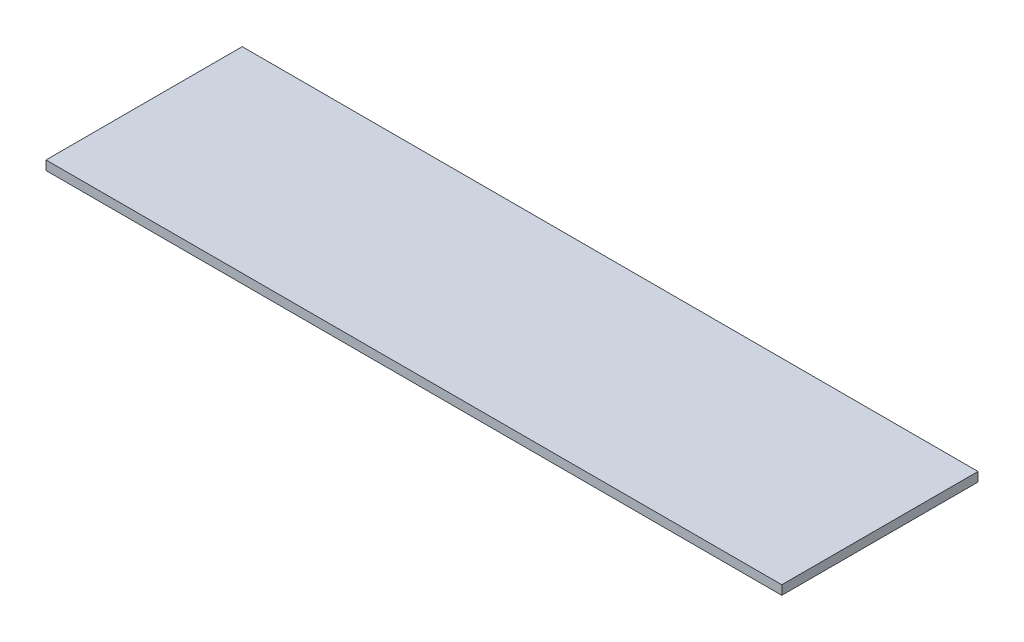
ISO-10303-21;
HEADER;
FILE_DESCRIPTION(('STEP AP214'),'2;1');
FILE_NAME('part.step','',(''),(''),'','','');
FILE_SCHEMA(('AUTOMOTIVE_DESIGN { 1 0 10303 214 1 1 1 1 }'));
ENDSEC;
DATA;
#1=APPLICATION_CONTEXT('core data for automotive mechanical design processes');
#2=APPLICATION_PROTOCOL_DEFINITION('international standard','automotive_design',2000,#1);
#3=PRODUCT_CONTEXT('',#1,'mechanical');
#4=PRODUCT('Part','Part','',(#3));
#5=PRODUCT_RELATED_PRODUCT_CATEGORY('part','',(#4));
#6=PRODUCT_DEFINITION_FORMATION('','',#4);
#7=PRODUCT_DEFINITION_CONTEXT('part definition',#1,'design');
#8=PRODUCT_DEFINITION('design','',#6,#7);
#9=PRODUCT_DEFINITION_SHAPE('','',#8);
#10=(LENGTH_UNIT() NAMED_UNIT(*) SI_UNIT(.MILLI.,.METRE.));
#11=(NAMED_UNIT(*) PLANE_ANGLE_UNIT() SI_UNIT($,.RADIAN.));
#12=(NAMED_UNIT(*) SI_UNIT($,.STERADIAN.) SOLID_ANGLE_UNIT());
#13=UNCERTAINTY_MEASURE_WITH_UNIT(LENGTH_MEASURE(1.E-05),#10,'distance_accuracy_value','');
#14=(GEOMETRIC_REPRESENTATION_CONTEXT(3) GLOBAL_UNCERTAINTY_ASSIGNED_CONTEXT((#13)) GLOBAL_UNIT_ASSIGNED_CONTEXT((#10,
#11,#12)) REPRESENTATION_CONTEXT('',''));
#15=CARTESIAN_POINT('',(0.,0.,0.));
#16=DIRECTION('',(0.,0.,1.));
#17=DIRECTION('',(1.,0.,0.));
#18=AXIS2_PLACEMENT_3D('',#15,#16,#17);
#19=CARTESIAN_POINT('',(0.,4.7625,0.));
#20=DIRECTION('',(1.,0.,0.));
#21=DIRECTION('',(0.,0.,-1.));
#22=AXIS2_PLACEMENT_3D('',#19,#20,#21);
#23=PLANE('',#22);
#24=DIRECTION('',(0.,0.,1.));
#25=VECTOR('',#24,1.);
#26=CARTESIAN_POINT('',(0.,0.,0.));
#27=LINE('',#26,#25);
#28=CARTESIAN_POINT('',(0.,0.,-101.6));
#29=VERTEX_POINT('',#28);
#30=CARTESIAN_POINT('',(0.,0.,0.));
#31=VERTEX_POINT('',#30);
#32=EDGE_CURVE('E102',#29,#31,#27,.T.);
#33=ORIENTED_EDGE('',*,*,#32,.T.);
#34=DIRECTION('',(0.,-1.,0.));
#35=VECTOR('',#34,1.);
#36=CARTESIAN_POINT('',(0.,4.7625,0.));
#37=LINE('',#36,#35);
#38=CARTESIAN_POINT('',(0.,4.7625,0.));
#39=VERTEX_POINT('',#38);
#40=EDGE_CURVE('E11',#39,#31,#37,.T.);
#41=ORIENTED_EDGE('',*,*,#40,.F.);
#42=DIRECTION('',(0.,0.,1.));
#43=VECTOR('',#42,1.);
#44=CARTESIAN_POINT('',(0.,4.7625,0.));
#45=LINE('',#44,#43);
#46=CARTESIAN_POINT('',(0.,4.7625,-101.6));
#47=VERTEX_POINT('',#46);
#48=EDGE_CURVE('E90',#47,#39,#45,.T.);
#49=ORIENTED_EDGE('',*,*,#48,.F.);
#50=DIRECTION('',(0.,-1.,0.));
#51=VECTOR('',#50,1.);
#52=CARTESIAN_POINT('',(0.,4.7625,-101.6));
#53=LINE('',#52,#51);
#54=EDGE_CURVE('E98',#47,#29,#53,.T.);
#55=ORIENTED_EDGE('',*,*,#54,.T.);
#56=EDGE_LOOP('',(#33,#41,#49,#55));
#57=FACE_BOUND('',#56,.T.);
#58=ADVANCED_FACE('F39',(#57),#23,.F.);
#59=CARTESIAN_POINT('',(0.,4.7625,0.));
#60=DIRECTION('',(0.,0.,-1.));
#61=DIRECTION('',(-1.,0.,0.));
#62=AXIS2_PLACEMENT_3D('',#59,#60,#61);
#63=PLANE('',#62);
#64=DIRECTION('',(1.,0.,0.));
#65=VECTOR('',#64,1.);
#66=CARTESIAN_POINT('',(0.,0.,0.));
#67=LINE('',#66,#65);
#68=CARTESIAN_POINT('',(381.,0.,0.));
#69=VERTEX_POINT('',#68);
#70=EDGE_CURVE('E94',#31,#69,#67,.T.);
#71=ORIENTED_EDGE('',*,*,#70,.T.);
#72=DIRECTION('',(0.,-1.,0.));
#73=VECTOR('',#72,1.);
#74=CARTESIAN_POINT('',(381.,4.7625,0.));
#75=LINE('',#74,#73);
#76=CARTESIAN_POINT('',(381.,4.7625,0.));
#77=VERTEX_POINT('',#76);
#78=EDGE_CURVE('E47',#77,#69,#75,.T.);
#79=ORIENTED_EDGE('',*,*,#78,.F.);
#80=DIRECTION('',(1.,0.,0.));
#81=VECTOR('',#80,1.);
#82=CARTESIAN_POINT('',(0.,4.7625,0.));
#83=LINE('',#82,#81);
#84=EDGE_CURVE('E85',#39,#77,#83,.T.);
#85=ORIENTED_EDGE('',*,*,#84,.F.);
#86=ORIENTED_EDGE('',*,*,#40,.T.);
#87=EDGE_LOOP('',(#71,#79,#85,#86));
#88=FACE_BOUND('',#87,.T.);
#89=ADVANCED_FACE('F93',(#88),#63,.F.);
#90=CARTESIAN_POINT('',(381.,4.7625,0.));
#91=DIRECTION('',(-1.,0.,0.));
#92=DIRECTION('',(0.,0.,1.));
#93=AXIS2_PLACEMENT_3D('',#90,#91,#92);
#94=PLANE('',#93);
#95=DIRECTION('',(0.,0.,-1.));
#96=VECTOR('',#95,1.);
#97=CARTESIAN_POINT('',(381.,0.,0.));
#98=LINE('',#97,#96);
#99=CARTESIAN_POINT('',(381.,0.,-101.6));
#100=VERTEX_POINT('',#99);
#101=EDGE_CURVE('E72',#69,#100,#98,.T.);
#102=ORIENTED_EDGE('',*,*,#101,.T.);
#103=DIRECTION('',(0.,-1.,0.));
#104=VECTOR('',#103,1.);
#105=CARTESIAN_POINT('',(381.,4.7625,-101.6));
#106=LINE('',#105,#104);
#107=CARTESIAN_POINT('',(381.,4.7625,-101.6));
#108=VERTEX_POINT('',#107);
#109=EDGE_CURVE('E95',#108,#100,#106,.T.);
#110=ORIENTED_EDGE('',*,*,#109,.F.);
#111=DIRECTION('',(0.,0.,-1.));
#112=VECTOR('',#111,1.);
#113=CARTESIAN_POINT('',(381.,4.7625,0.));
#114=LINE('',#113,#112);
#115=EDGE_CURVE('E88',#77,#108,#114,.T.);
#116=ORIENTED_EDGE('',*,*,#115,.F.);
#117=ORIENTED_EDGE('',*,*,#78,.T.);
#118=EDGE_LOOP('',(#102,#110,#116,#117));
#119=FACE_BOUND('',#118,.T.);
#120=ADVANCED_FACE('F96',(#119),#94,.F.);
#121=CARTESIAN_POINT('',(0.,4.7625,-101.6));
#122=DIRECTION('',(0.,0.,1.));
#123=DIRECTION('',(1.,0.,0.));
#124=AXIS2_PLACEMENT_3D('',#121,#122,#123);
#125=PLANE('',#124);
#126=DIRECTION('',(-1.,0.,0.));
#127=VECTOR('',#126,1.);
#128=CARTESIAN_POINT('',(0.,0.,-101.6));
#129=LINE('',#128,#127);
#130=EDGE_CURVE('E78',#100,#29,#129,.T.);
#131=ORIENTED_EDGE('',*,*,#130,.T.);
#132=ORIENTED_EDGE('',*,*,#54,.F.);
#133=DIRECTION('',(-1.,0.,0.));
#134=VECTOR('',#133,1.);
#135=CARTESIAN_POINT('',(0.,4.7625,-101.6));
#136=LINE('',#135,#134);
#137=EDGE_CURVE('E55',#108,#47,#136,.T.);
#138=ORIENTED_EDGE('',*,*,#137,.F.);
#139=ORIENTED_EDGE('',*,*,#109,.T.);
#140=EDGE_LOOP('',(#131,#132,#138,#139));
#141=FACE_BOUND('',#140,.T.);
#142=ADVANCED_FACE('F109',(#141),#125,.F.);
#143=CARTESIAN_POINT('',(0.,4.7625,0.));
#144=DIRECTION('',(0.,-1.,0.));
#145=DIRECTION('',(0.,0.,-1.));
#146=AXIS2_PLACEMENT_3D('',#143,#144,#145);
#147=PLANE('',#146);
#148=ORIENTED_EDGE('',*,*,#48,.T.);
#149=ORIENTED_EDGE('',*,*,#84,.T.);
#150=ORIENTED_EDGE('',*,*,#115,.T.);
#151=ORIENTED_EDGE('',*,*,#137,.T.);
#152=EDGE_LOOP('',(#148,#149,#150,#151));
#153=FACE_BOUND('',#152,.T.);
#154=ADVANCED_FACE('F86',(#153),#147,.F.);
#155=CARTESIAN_POINT('',(0.,0.,0.));
#156=DIRECTION('',(0.,-1.,0.));
#157=DIRECTION('',(0.,0.,-1.));
#158=AXIS2_PLACEMENT_3D('',#155,#156,#157);
#159=PLANE('',#158);
#160=ORIENTED_EDGE('',*,*,#32,.F.);
#161=ORIENTED_EDGE('',*,*,#130,.F.);
#162=ORIENTED_EDGE('',*,*,#101,.F.);
#163=ORIENTED_EDGE('',*,*,#70,.F.);
#164=EDGE_LOOP('',(#160,#161,#162,#163));
#165=FACE_BOUND('',#164,.T.);
#166=ADVANCED_FACE('F112',(#165),#159,.T.);
#167=CLOSED_SHELL('',(#58,#89,#120,#142,#154,#166));
#168=MANIFOLD_SOLID_BREP('B2',#167);
#169=ADVANCED_BREP_SHAPE_REPRESENTATION('',(#18,#168),#14);
#170=SHAPE_DEFINITION_REPRESENTATION(#9,#169);
ENDSEC;
END-ISO-10303-21;
